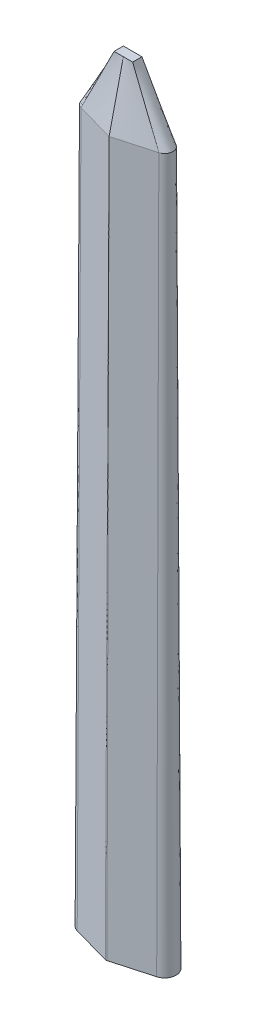
ISO-10303-21;
HEADER;
FILE_DESCRIPTION(('STEP AP214'),'2;1');
FILE_NAME('part.step','',(''),(''),'','','');
FILE_SCHEMA(('AUTOMOTIVE_DESIGN { 1 0 10303 214 1 1 1 1 }'));
ENDSEC;
DATA;
#1=APPLICATION_CONTEXT('core data for automotive mechanical design processes');
#2=APPLICATION_PROTOCOL_DEFINITION('international standard','automotive_design',2000,#1);
#3=PRODUCT_CONTEXT('',#1,'mechanical');
#4=PRODUCT('Part','Part','',(#3));
#5=PRODUCT_RELATED_PRODUCT_CATEGORY('part','',(#4));
#6=PRODUCT_DEFINITION_FORMATION('','',#4);
#7=PRODUCT_DEFINITION_CONTEXT('part definition',#1,'design');
#8=PRODUCT_DEFINITION('design','',#6,#7);
#9=PRODUCT_DEFINITION_SHAPE('','',#8);
#10=(LENGTH_UNIT() NAMED_UNIT(*) SI_UNIT(.MILLI.,.METRE.));
#11=(NAMED_UNIT(*) PLANE_ANGLE_UNIT() SI_UNIT($,.RADIAN.));
#12=(NAMED_UNIT(*) SI_UNIT($,.STERADIAN.) SOLID_ANGLE_UNIT());
#13=UNCERTAINTY_MEASURE_WITH_UNIT(LENGTH_MEASURE(1.E-05),#10,'distance_accuracy_value','');
#14=(GEOMETRIC_REPRESENTATION_CONTEXT(3) GLOBAL_UNCERTAINTY_ASSIGNED_CONTEXT((#13)) GLOBAL_UNIT_ASSIGNED_CONTEXT((#10,
#11,#12)) REPRESENTATION_CONTEXT('',''));
#15=CARTESIAN_POINT('',(0.,0.,0.));
#16=DIRECTION('',(0.,0.,1.));
#17=DIRECTION('',(1.,0.,0.));
#18=AXIS2_PLACEMENT_3D('',#15,#16,#17);
#19=CARTESIAN_POINT('',(0.,0.,-6.1));
#20=DIRECTION('',(0.,-1.,0.));
#21=DIRECTION('',(0.,0.,1.));
#22=AXIS2_PLACEMENT_3D('',#19,#20,#21);
#23=CONICAL_SURFACE('',#22,1.00914801576978,0.00436332312998583);
#24=CARTESIAN_POINT('',(0.,0.,-6.1));
#25=DIRECTION('',(0.,1.,0.));
#26=DIRECTION('',(0.,0.,1.));
#27=AXIS2_PLACEMENT_3D('',#24,#25,#26);
#28=CIRCLE('',#27,1.00914801576978);
#29=CARTESIAN_POINT('',(0.270530283915286,0.,-7.07221041097944));
#30=VERTEX_POINT('',#29);
#31=CARTESIAN_POINT('',(-0.270530283915274,0.,-7.07221041097944));
#32=VERTEX_POINT('',#31);
#33=EDGE_CURVE('E531',#30,#32,#28,.T.);
#34=ORIENTED_EDGE('',*,*,#33,.T.);
#35=DIRECTION('',(-0.00116970680332982,-0.999990480720734,-0.00420360011283182));
#36=VECTOR('',#35,1.);
#37=CARTESIAN_POINT('',(-0.270530283915274,0.,-7.07221041097944));
#38=LINE('',#37,#36);
#39=CARTESIAN_POINT('',(0.,230.,-6.10537318143453));
#40=VERTEX_POINT('',#39);
#41=EDGE_CURVE('E477',#40,#32,#38,.T.);
#42=ORIENTED_EDGE('',*,*,#41,.F.);
#43=DIRECTION('',(0.00116970680332981,-0.999990480720734,-0.00420360011283182));
#44=VECTOR('',#43,1.);
#45=CARTESIAN_POINT('',(0.270530283915286,0.,-7.07221041097944));
#46=LINE('',#45,#44);
#47=EDGE_CURVE('E485',#40,#30,#46,.T.);
#48=ORIENTED_EDGE('',*,*,#47,.T.);
#49=EDGE_LOOP('',(#34,#42,#48));
#50=FACE_BOUND('',#49,.T.);
#51=ADVANCED_FACE('F69',(#50),#23,.T.);
#52=CARTESIAN_POINT('',(-0.270530283915274,0.,-7.07221041097944));
#53=DIRECTION('',(-0.268075351122406,0.00436330928474658,-0.963388067007623));
#54=DIRECTION('',(-0.963397237854974,0.,0.26807790303083));
#55=AXIS2_PLACEMENT_3D('',#52,#53,#54);
#56=PLANE('',#55);
#57=DIRECTION('',(-0.963397237854974,0.,0.26807790303083));
#58=VECTOR('',#57,1.);
#59=CARTESIAN_POINT('',(-0.270530283915274,0.,-7.07221041097944));
#60=LINE('',#59,#58);
#61=CARTESIAN_POINT('',(-12.8443406220985,0.,-3.57338295318787));
#62=VERTEX_POINT('',#61);
#63=EDGE_CURVE('E528',#32,#62,#60,.T.);
#64=ORIENTED_EDGE('',*,*,#63,.T.);
#65=DIRECTION('',(-0.00116970680332981,-0.999990480720734,-0.00420360011283182));
#66=VECTOR('',#65,1.);
#67=CARTESIAN_POINT('',(-12.8443406220985,0.,-3.57338295318787));
#68=LINE('',#67,#66);
#69=CARTESIAN_POINT('',(-12.5753054963122,230.,-2.60654572364296));
#70=VERTEX_POINT('',#69);
#71=EDGE_CURVE('E482',#70,#62,#68,.T.);
#72=ORIENTED_EDGE('',*,*,#71,.F.);
#73=DIRECTION('',(-0.963397237854974,0.,0.26807790303083));
#74=VECTOR('',#73,1.);
#75=CARTESIAN_POINT('',(-0.00149515812892143,230.,-6.10537318143453));
#76=LINE('',#75,#74);
#77=EDGE_CURVE('E446',#40,#70,#76,.T.);
#78=ORIENTED_EDGE('',*,*,#77,.F.);
#79=ORIENTED_EDGE('',*,*,#41,.T.);
#80=EDGE_LOOP('',(#64,#72,#78,#79));
#81=FACE_BOUND('',#80,.T.);
#82=ADVANCED_FACE('F718',(#81),#56,.T.);
#83=CARTESIAN_POINT('',(-11.85,0.,0.));
#84=DIRECTION('',(0.,-1.,0.));
#85=DIRECTION('',(0.,0.,1.));
#86=AXIS2_PLACEMENT_3D('',#83,#84,#85);
#87=CONICAL_SURFACE('',#86,3.70914801576978,0.00436332312998583);
#88=CARTESIAN_POINT('',(-11.85,0.,0.));
#89=DIRECTION('',(0.,1.,0.));
#90=DIRECTION('',(0.,0.,1.));
#91=AXIS2_PLACEMENT_3D('',#88,#89,#90);
#92=CIRCLE('',#91,3.70914801576978);
#93=CARTESIAN_POINT('',(-12.8443406220985,0.,3.57338295318787));
#94=VERTEX_POINT('',#93);
#95=EDGE_CURVE('E525',#62,#94,#92,.T.);
#96=ORIENTED_EDGE('',*,*,#95,.T.);
#97=DIRECTION('',(-0.00116970680332981,-0.999990480720734,0.00420360011283182));
#98=VECTOR('',#97,1.);
#99=CARTESIAN_POINT('',(-12.8443406220985,0.,3.57338295318787));
#100=LINE('',#99,#98);
#101=CARTESIAN_POINT('',(-12.5753054963122,230.,2.60654572364296));
#102=VERTEX_POINT('',#101);
#103=EDGE_CURVE('E474',#102,#94,#100,.T.);
#104=ORIENTED_EDGE('',*,*,#103,.F.);
#105=CARTESIAN_POINT('',(-12.5753054963122,230.,-2.60654572364296));
#106=CARTESIAN_POINT('',(-12.6114563932215,230.000007225369,-2.5964861900037));
#107=CARTESIAN_POINT('',(-12.6473934194865,230.000089608595,-2.58567547119507));
#108=CARTESIAN_POINT('',(-12.7187864080056,230.000329309486,-2.56256885966117));
#109=CARTESIAN_POINT('',(-12.7542423721637,230.000486626855,-2.55027297281584));
#110=CARTESIAN_POINT('',(-12.8597902913709,230.000957826549,-2.51119019631628));
#111=CARTESIAN_POINT('',(-12.9290816682881,230.001271040976,-2.48220279095765));
#112=CARTESIAN_POINT('',(-13.0649687079224,230.001670643937,-2.41859190481421));
#113=CARTESIAN_POINT('',(-13.1315659003823,230.001757163019,-2.38397168002757));
#114=CARTESIAN_POINT('',(-13.2616571338923,230.001653723151,-2.30931962888276));
#115=CARTESIAN_POINT('',(-13.3251511787795,230.001463764542,-2.26928780921609));
#116=CARTESIAN_POINT('',(-13.4494657804984,230.000846340845,-2.18348854748175));
#117=CARTESIAN_POINT('',(-13.5102359632002,230.000415561838,-2.13764813543431));
#118=CARTESIAN_POINT('',(-13.627700393699,229.999623863179,-2.04101031362432));
#119=CARTESIAN_POINT('',(-13.6843945671038,229.999262944801,-1.99021281342882));
#120=CARTESIAN_POINT('',(-13.7932924564327,229.998758883674,-1.8840314811998));
#121=CARTESIAN_POINT('',(-13.8454970070409,229.99861570036,-1.82864850544497));
#122=CARTESIAN_POINT('',(-13.9450551739325,229.998633791299,-1.7136822848377));
#123=CARTESIAN_POINT('',(-13.9924088139629,229.998795064062,-1.65409906054953));
#124=CARTESIAN_POINT('',(-14.0819196760416,229.999333219242,-1.53116911290684));
#125=CARTESIAN_POINT('',(-14.1240779478046,229.999710058017,-1.46782315365198));
#126=CARTESIAN_POINT('',(-14.2029117663397,230.000363949684,-1.33780643346991));
#127=CARTESIAN_POINT('',(-14.2395873174444,230.000641002653,-1.27113567517003));
#128=CARTESIAN_POINT('',(-14.3072009027807,230.000979436492,-1.13493209580544));
#129=CARTESIAN_POINT('',(-14.3381380478227,230.001040783963,-1.06539883322027));
#130=CARTESIAN_POINT('',(-14.3940479785404,230.000896920646,-0.923974682350856));
#131=CARTESIAN_POINT('',(-14.4190207435258,230.000691708933,-0.852083785889032));
#132=CARTESIAN_POINT('',(-14.4628295065202,230.000245423498,-0.706434235571706));
#133=CARTESIAN_POINT('',(-14.4816638557704,230.000004340167,-0.632675085633168));
#134=CARTESIAN_POINT('',(-14.5130517811376,229.999720893798,-0.483834649586878));
#135=CARTESIAN_POINT('',(-14.5256053714758,229.999678530311,-0.408753366473125));
#136=CARTESIAN_POINT('',(-14.5443418693743,229.999749122724,-0.257796217289434));
#137=CARTESIAN_POINT('',(-14.5505252677514,229.999862066657,-0.18192041289167));
#138=CARTESIAN_POINT('',(-14.554991901975,229.999974808288,-0.0679375519443198));
#139=CARTESIAN_POINT('',(-14.5556791771169,230.000002943096,-0.0299108050769732));
#140=CARTESIAN_POINT('',(-14.5554511499297,229.999996114029,0.0461378790196297));
#141=CARTESIAN_POINT('',(-14.5545358474551,229.999961150148,0.0841598162484493));
#142=CARTESIAN_POINT('',(-14.5493854824651,229.999838238708,0.198118926249784));
#143=CARTESIAN_POINT('',(-14.5427464302863,229.999732266032,0.273961371555549));
#144=CARTESIAN_POINT('',(-14.5231034014869,229.99968296884,0.424807464363447));
#145=CARTESIAN_POINT('',(-14.5100994375171,229.999739644001,0.499811113532432));
#146=CARTESIAN_POINT('',(-14.4778182346591,230.000047354978,0.648462129272696));
#147=CARTESIAN_POINT('',(-14.458540684601,230.000298400436,0.72210942837752));
#148=CARTESIAN_POINT('',(-14.4138505239472,230.0007378932,0.867517867584566));
#149=CARTESIAN_POINT('',(-14.3884379203833,230.000926340578,0.939279009848581));
#150=CARTESIAN_POINT('',(-14.331659286816,230.001035799597,1.08040563503285));
#151=CARTESIAN_POINT('',(-14.3002933257409,230.000956814335,1.14977114567888));
#152=CARTESIAN_POINT('',(-14.2318306180704,230.000587889274,1.28561382144818));
#153=CARTESIAN_POINT('',(-14.1947338276773,230.000297947863,1.3520909644922));
#154=CARTESIAN_POINT('',(-14.1150730842732,229.999634085879,1.48168357376822));
#155=CARTESIAN_POINT('',(-14.0725091695106,229.999260165892,1.54479906351421));
#156=CARTESIAN_POINT('',(-13.9822155396203,229.998749805429,1.6672192069278));
#157=CARTESIAN_POINT('',(-13.9344859255474,229.998613360309,1.72652393510782));
#158=CARTESIAN_POINT('',(-13.834193936591,229.998638567584,1.84090772330834));
#159=CARTESIAN_POINT('',(-13.7816310134596,229.998800253838,1.89598630264878));
#160=CARTESIAN_POINT('',(-13.6720522796682,229.999335348502,2.00151859977009));
#161=CARTESIAN_POINT('',(-13.6150364119813,229.999708759624,2.05197225830377));
#162=CARTESIAN_POINT('',(-13.4969690037837,230.000505210167,2.14788531426279));
#163=CARTESIAN_POINT('',(-13.4359185244465,230.00092823656,2.19334601661552));
#164=CARTESIAN_POINT('',(-13.310231188882,230.001520993615,2.27895215720668));
#165=CARTESIAN_POINT('',(-13.2455950653873,230.001690775832,2.31909867577138));
#166=CARTESIAN_POINT('',(-13.0841747969021,230.001751575344,2.41015459767389));
#167=CARTESIAN_POINT('',(-12.9856867304961,230.00148832698,2.45809937408764));
#168=CARTESIAN_POINT('',(-12.8342902483684,230.000851882387,2.52077153860593));
#169=CARTESIAN_POINT('',(-12.7832369579247,230.000599633869,2.540115039083));
#170=CARTESIAN_POINT('',(-12.6800442636341,230.000187386022,2.57568371165004));
#171=CARTESIAN_POINT('',(-12.6279046558845,230.000027404175,2.59190829236378));
#172=CARTESIAN_POINT('',(-12.5753054963122,230.,2.60654572364296));
#173=B_SPLINE_CURVE_WITH_KNOTS('',3,(#105,#106,#107,#108,#109,#110,#111,#112,#113,#114,#115,
#116,#117,#118,#119,#120,#121,#122,#123,#124,#125,#126,#127,#128,#129,#130,#131,#132,#133,#134,
#135,#136,#137,#138,#139,#140,#141,#142,#143,#144,#145,#146,#147,#148,#149,#150,#151,#152,#153,
#154,#155,#156,#157,#158,#159,#160,#161,#162,#163,#164,#165,#166,#167,#168,#169,#170,#171,#172),
.UNSPECIFIED.,.F.,.F.,(4,2,2,2,2,2,2,2,2,2,2,2,2,2,2,2,2,2,2,2,2,2,2,2,2,2,2,2,2,2,2,2,2,4),(0.,
0.112555889927781,0.225111334248274,0.450162013003811,0.675083062513077,0.900003833907121,
1.12809874363309,1.35619781530874,1.58425438806581,1.81230984434365,2.04031914661809,
2.2683282687167,2.4963726923063,2.72441790696365,2.9525243234547,3.18063022346035,
3.40871854682498,3.52278825712151,3.63685797776697,3.86496158447767,4.09306473782093,
4.32117920680619,4.5492934143297,4.77740498089494,5.00551829088317,5.23363000506135,
5.46173725757688,5.6898704165571,5.91800649761142,6.14608281186475,6.37411268879075,
6.70180349868786,6.86550697512056,7.02924146070607),.UNSPECIFIED.);
#174=EDGE_CURVE('E437',#70,#102,#173,.T.);
#175=ORIENTED_EDGE('',*,*,#174,.F.);
#176=ORIENTED_EDGE('',*,*,#71,.T.);
#177=EDGE_LOOP('',(#96,#104,#175,#176));
#178=FACE_BOUND('',#177,.T.);
#179=ADVANCED_FACE('F724',(#178),#87,.T.);
#180=CARTESIAN_POINT('',(-12.8443406220985,0.,3.57338295318787));
#181=DIRECTION('',(-0.268075351122406,0.00436330928474658,0.963388067007623));
#182=DIRECTION('',(0.963397237854974,0.,0.26807790303083));
#183=AXIS2_PLACEMENT_3D('',#180,#181,#182);
#184=PLANE('',#183);
#185=DIRECTION('',(0.963397237854974,0.,0.26807790303083));
#186=VECTOR('',#185,1.);
#187=CARTESIAN_POINT('',(-12.8443406220985,0.,3.57338295318787));
#188=LINE('',#187,#186);
#189=CARTESIAN_POINT('',(-0.270530283915282,0.,7.07221041097944));
#190=VERTEX_POINT('',#189);
#191=EDGE_CURVE('E522',#94,#190,#188,.T.);
#192=ORIENTED_EDGE('',*,*,#191,.T.);
#193=DIRECTION('',(-0.0011697068033298,-0.999990480720734,0.00420360011283182));
#194=VECTOR('',#193,1.);
#195=CARTESIAN_POINT('',(-0.270530283915282,0.,7.07221041097944));
#196=LINE('',#195,#194);
#197=CARTESIAN_POINT('',(0.,230.,6.10537318143453));
#198=VERTEX_POINT('',#197);
#199=EDGE_CURVE('E467',#198,#190,#196,.T.);
#200=ORIENTED_EDGE('',*,*,#199,.F.);
#201=DIRECTION('',(0.963397237854974,0.,0.26807790303083));
#202=VECTOR('',#201,1.);
#203=CARTESIAN_POINT('',(-12.5753054963122,230.,2.60654572364296));
#204=LINE('',#203,#202);
#205=EDGE_CURVE('E601',#102,#198,#204,.T.);
#206=ORIENTED_EDGE('',*,*,#205,.F.);
#207=ORIENTED_EDGE('',*,*,#103,.T.);
#208=EDGE_LOOP('',(#192,#200,#206,#207));
#209=FACE_BOUND('',#208,.T.);
#210=ADVANCED_FACE('F760',(#209),#184,.T.);
#211=CARTESIAN_POINT('',(0.,0.,6.1));
#212=DIRECTION('',(0.,-1.,0.));
#213=DIRECTION('',(0.,0.,1.));
#214=AXIS2_PLACEMENT_3D('',#211,#212,#213);
#215=CONICAL_SURFACE('',#214,1.00914801576978,0.00436332312998583);
#216=CARTESIAN_POINT('',(0.,0.,6.1));
#217=DIRECTION('',(0.,1.,0.));
#218=DIRECTION('',(0.,0.,1.));
#219=AXIS2_PLACEMENT_3D('',#216,#217,#218);
#220=CIRCLE('',#219,1.00914801576978);
#221=CARTESIAN_POINT('',(0.270530283915291,0.,7.07221041097944));
#222=VERTEX_POINT('',#221);
#223=EDGE_CURVE('E519',#190,#222,#220,.T.);
#224=ORIENTED_EDGE('',*,*,#223,.T.);
#225=DIRECTION('',(0.00116970680332982,-0.999990480720734,0.00420360011283182));
#226=VECTOR('',#225,1.);
#227=CARTESIAN_POINT('',(0.270530283915291,0.,7.07221041097944));
#228=LINE('',#227,#226);
#229=EDGE_CURVE('E463',#198,#222,#228,.T.);
#230=ORIENTED_EDGE('',*,*,#229,.F.);
#231=ORIENTED_EDGE('',*,*,#199,.T.);
#232=EDGE_LOOP('',(#224,#230,#231));
#233=FACE_BOUND('',#232,.T.);
#234=ADVANCED_FACE('F763',(#233),#215,.T.);
#235=CARTESIAN_POINT('',(0.270530283915291,0.,7.07221041097944));
#236=DIRECTION('',(0.268075351122406,0.00436330928474658,0.963388067007623));
#237=DIRECTION('',(0.963397237854974,0.,-0.26807790303083));
#238=AXIS2_PLACEMENT_3D('',#235,#236,#237);
#239=PLANE('',#238);
#240=DIRECTION('',(0.963397237854974,0.,-0.26807790303083));
#241=VECTOR('',#240,1.);
#242=CARTESIAN_POINT('',(0.270530283915291,0.,7.07221041097944));
#243=LINE('',#242,#241);
#244=CARTESIAN_POINT('',(12.8443406220985,0.,3.57338295318787));
#245=VERTEX_POINT('',#244);
#246=EDGE_CURVE('E516',#222,#245,#243,.T.);
#247=ORIENTED_EDGE('',*,*,#246,.T.);
#248=DIRECTION('',(0.00116970680332982,-0.999990480720734,0.00420360011283182));
#249=VECTOR('',#248,1.);
#250=CARTESIAN_POINT('',(12.8443406220985,0.,3.57338295318787));
#251=LINE('',#250,#249);
#252=CARTESIAN_POINT('',(12.5753054963122,230.,2.60654572364296));
#253=VERTEX_POINT('',#252);
#254=EDGE_CURVE('E468',#253,#245,#251,.T.);
#255=ORIENTED_EDGE('',*,*,#254,.F.);
#256=DIRECTION('',(0.963397237854974,0.,-0.26807790303083));
#257=VECTOR('',#256,1.);
#258=CARTESIAN_POINT('',(0.00149515812893861,230.,6.10537318143453));
#259=LINE('',#258,#257);
#260=EDGE_CURVE('E232',#198,#253,#259,.T.);
#261=ORIENTED_EDGE('',*,*,#260,.F.);
#262=ORIENTED_EDGE('',*,*,#229,.T.);
#263=EDGE_LOOP('',(#247,#255,#261,#262));
#264=FACE_BOUND('',#263,.T.);
#265=ADVANCED_FACE('F737',(#264),#239,.T.);
#266=CARTESIAN_POINT('',(11.85,0.,0.));
#267=DIRECTION('',(0.,-1.,0.));
#268=DIRECTION('',(0.,0.,1.));
#269=AXIS2_PLACEMENT_3D('',#266,#267,#268);
#270=CONICAL_SURFACE('',#269,3.70914801576978,0.00436332312998583);
#271=CARTESIAN_POINT('',(11.85,0.,0.));
#272=DIRECTION('',(0.,1.,0.));
#273=DIRECTION('',(0.,0.,1.));
#274=AXIS2_PLACEMENT_3D('',#271,#272,#273);
#275=CIRCLE('',#274,3.70914801576978);
#276=CARTESIAN_POINT('',(12.8443406220985,0.,-3.57338295318786));
#277=VERTEX_POINT('',#276);
#278=EDGE_CURVE('E513',#245,#277,#275,.T.);
#279=ORIENTED_EDGE('',*,*,#278,.T.);
#280=DIRECTION('',(0.00116970680332982,-0.999990480720734,-0.00420360011283182));
#281=VECTOR('',#280,1.);
#282=CARTESIAN_POINT('',(12.8443406220985,0.,-3.57338295318786));
#283=LINE('',#282,#281);
#284=CARTESIAN_POINT('',(12.5753054963122,230.,-2.60654572364295));
#285=VERTEX_POINT('',#284);
#286=EDGE_CURVE('E489',#285,#277,#283,.T.);
#287=ORIENTED_EDGE('',*,*,#286,.F.);
#288=CARTESIAN_POINT('',(12.5753054963122,230.,2.60654572364296));
#289=CARTESIAN_POINT('',(12.6114563932216,230.000007225369,2.5964861900037));
#290=CARTESIAN_POINT('',(12.6473934194865,230.000089608595,2.58567547119507));
#291=CARTESIAN_POINT('',(12.7187864080056,230.000329309486,2.56256885966116));
#292=CARTESIAN_POINT('',(12.7542423721637,230.000486626855,2.55027297281583));
#293=CARTESIAN_POINT('',(12.859790291371,230.000957826549,2.51119019631627));
#294=CARTESIAN_POINT('',(12.9290816682881,230.001271040976,2.48220279095763));
#295=CARTESIAN_POINT('',(13.0649687079224,230.001670643937,2.41859190481418));
#296=CARTESIAN_POINT('',(13.1315659003823,230.001757163019,2.38397168002753));
#297=CARTESIAN_POINT('',(13.2616571338924,230.001653723151,2.30931962888271));
#298=CARTESIAN_POINT('',(13.3251511787796,230.001463764542,2.26928780921603));
#299=CARTESIAN_POINT('',(13.4494657804985,230.000846340845,2.18348854748168));
#300=CARTESIAN_POINT('',(13.5102359632003,230.000415561838,2.13764813543424));
#301=CARTESIAN_POINT('',(13.627700393699,229.999623863179,2.04101031362424));
#302=CARTESIAN_POINT('',(13.6843945671039,229.999262944801,1.99021281342874));
#303=CARTESIAN_POINT('',(13.7932924564328,229.998758883674,1.88403148119971));
#304=CARTESIAN_POINT('',(13.845497007041,229.99861570036,1.82864850544488));
#305=CARTESIAN_POINT('',(13.9450551739325,229.9986337913,1.7136822848376));
#306=CARTESIAN_POINT('',(13.992408813963,229.998795064062,1.65409906054943));
#307=CARTESIAN_POINT('',(14.0819196760417,229.999333219242,1.53116911290673));
#308=CARTESIAN_POINT('',(14.1240779478047,229.999710058017,1.46782315365187));
#309=CARTESIAN_POINT('',(14.2029117663398,230.000363949684,1.33780643346979));
#310=CARTESIAN_POINT('',(14.2395873174445,230.000641002653,1.27113567516991));
#311=CARTESIAN_POINT('',(14.3072009027808,230.000979436492,1.13493209580531));
#312=CARTESIAN_POINT('',(14.3381380478228,230.001040783963,1.06539883322014));
#313=CARTESIAN_POINT('',(14.3940479785404,230.000896920646,0.923974682350721));
#314=CARTESIAN_POINT('',(14.4190207435259,230.000691708933,0.852083785888894));
#315=CARTESIAN_POINT('',(14.4628295065203,230.000245423498,0.706434235571564));
#316=CARTESIAN_POINT('',(14.4816638557704,230.000004340167,0.632675085633026));
#317=CARTESIAN_POINT('',(14.5130517811376,229.999720893798,0.483834649586736));
#318=CARTESIAN_POINT('',(14.5256053714758,229.99967853031,0.408753366472983));
#319=CARTESIAN_POINT('',(14.5443418693743,229.999749122724,0.257796217289293));
#320=CARTESIAN_POINT('',(14.5505252677514,229.999862066657,0.18192041289153));
#321=CARTESIAN_POINT('',(14.554991901975,229.999974808288,0.0679375519441806));
#322=CARTESIAN_POINT('',(14.5556791771169,230.000002943096,0.0299108050768343));
#323=CARTESIAN_POINT('',(14.5554511499297,229.999996114029,-0.0461378790197677));
#324=CARTESIAN_POINT('',(14.5545358474551,229.999961150148,-0.0841598162485869));
#325=CARTESIAN_POINT('',(14.5493854824651,229.999838238708,-0.198118926249921));
#326=CARTESIAN_POINT('',(14.5427464302863,229.999732266032,-0.273961371555686));
#327=CARTESIAN_POINT('',(14.5231034014869,229.99968296884,-0.424807464363582));
#328=CARTESIAN_POINT('',(14.5100994375171,229.999739644,-0.499811113532566));
#329=CARTESIAN_POINT('',(14.477818234659,230.000047354978,-0.648462129272827));
#330=CARTESIAN_POINT('',(14.458540684601,230.000298400436,-0.72210942837765));
#331=CARTESIAN_POINT('',(14.4138505239471,230.0007378932,-0.867517867584693));
#332=CARTESIAN_POINT('',(14.3884379203832,230.000926340578,-0.939279009848706));
#333=CARTESIAN_POINT('',(14.3316592868159,230.001035799597,-1.08040563503297));
#334=CARTESIAN_POINT('',(14.3002933257409,230.000956814335,-1.149771145679));
#335=CARTESIAN_POINT('',(14.2318306180704,230.000587889274,-1.28561382144829));
#336=CARTESIAN_POINT('',(14.1947338276772,230.000297947863,-1.35209096449232));
#337=CARTESIAN_POINT('',(14.1150730842731,229.999634085878,-1.48168357376833));
#338=CARTESIAN_POINT('',(14.0725091695105,229.999260165892,-1.54479906351432));
#339=CARTESIAN_POINT('',(13.9822155396203,229.998749805429,-1.6672192069279));
#340=CARTESIAN_POINT('',(13.9344859255473,229.998613360308,-1.72652393510792));
#341=CARTESIAN_POINT('',(13.8341939365909,229.998638567584,-1.84090772330844));
#342=CARTESIAN_POINT('',(13.7816310134595,229.998800253838,-1.89598630264887));
#343=CARTESIAN_POINT('',(13.6720522796681,229.999335348502,-2.00151859977018));
#344=CARTESIAN_POINT('',(13.6150364119812,229.999708759624,-2.05197225830386));
#345=CARTESIAN_POINT('',(13.4969690037836,230.000505210167,-2.14788531426286));
#346=CARTESIAN_POINT('',(13.4359185244464,230.00092823656,-2.1933460166156));
#347=CARTESIAN_POINT('',(13.3102311888819,230.001520993615,-2.27895215720675));
#348=CARTESIAN_POINT('',(13.2455950653872,230.001690775832,-2.31909867577145));
#349=CARTESIAN_POINT('',(13.084174796902,230.001751575344,-2.41015459767394));
#350=CARTESIAN_POINT('',(12.9856867304961,230.00148832698,-2.45809937408768));
#351=CARTESIAN_POINT('',(12.8342902483684,230.000851882387,-2.52077153860594));
#352=CARTESIAN_POINT('',(12.7832369579247,230.000599633869,-2.54011503908301));
#353=CARTESIAN_POINT('',(12.6800442636341,230.000187386022,-2.57568371165004));
#354=CARTESIAN_POINT('',(12.6279046558845,230.000027404175,-2.59190829236378));
#355=CARTESIAN_POINT('',(12.5753054963122,230.,-2.60654572364296));
#356=B_SPLINE_CURVE_WITH_KNOTS('',3,(#288,#289,#290,#291,#292,#293,#294,#295,#296,#297,#298,
#299,#300,#301,#302,#303,#304,#305,#306,#307,#308,#309,#310,#311,#312,#313,#314,#315,#316,#317,
#318,#319,#320,#321,#322,#323,#324,#325,#326,#327,#328,#329,#330,#331,#332,#333,#334,#335,#336,
#337,#338,#339,#340,#341,#342,#343,#344,#345,#346,#347,#348,#349,#350,#351,#352,#353,#354,#355),
.UNSPECIFIED.,.F.,.F.,(4,2,2,2,2,2,2,2,2,2,2,2,2,2,2,2,2,2,2,2,2,2,2,2,2,2,2,2,2,2,2,2,2,4),(0.,
0.112555889927796,0.225111334248304,0.45016201300387,0.675083062513165,0.900003833907234,
1.12809874363321,1.35619781530886,1.58425438806594,1.81230984434377,2.04031914661822,
2.26832826871684,2.49637269230643,2.72441790696379,2.95252432345484,3.18063022346048,
3.40871854682512,3.52278825712165,3.6368579777671,3.8649615844778,4.09306473782106,
4.32117920680632,4.54929341432984,4.77740498089507,5.00551829088331,5.23363000506148,
5.46173725757701,5.68987041655723,5.91800649761155,6.14608281186487,6.37411268879087,
6.70180349868791,6.86550697512057,7.02924146070605),.UNSPECIFIED.);
#357=EDGE_CURVE('E606',#253,#285,#356,.T.);
#358=ORIENTED_EDGE('',*,*,#357,.F.);
#359=ORIENTED_EDGE('',*,*,#254,.T.);
#360=EDGE_LOOP('',(#279,#287,#358,#359));
#361=FACE_BOUND('',#360,.T.);
#362=ADVANCED_FACE('F732',(#361),#270,.T.);
#363=CARTESIAN_POINT('',(12.8443406220985,0.,-3.57338295318786));
#364=DIRECTION('',(0.268075351122406,0.00436330928474658,-0.963388067007623));
#365=DIRECTION('',(-0.963397237854974,0.,-0.26807790303083));
#366=AXIS2_PLACEMENT_3D('',#363,#364,#365);
#367=PLANE('',#366);
#368=DIRECTION('',(-0.963397237854974,0.,-0.26807790303083));
#369=VECTOR('',#368,1.);
#370=CARTESIAN_POINT('',(12.8443406220985,0.,-3.57338295318786));
#371=LINE('',#370,#369);
#372=EDGE_CURVE('E510',#277,#30,#371,.T.);
#373=ORIENTED_EDGE('',*,*,#372,.T.);
#374=ORIENTED_EDGE('',*,*,#47,.F.);
#375=DIRECTION('',(-0.963397237854974,0.,-0.26807790303083));
#376=VECTOR('',#375,1.);
#377=CARTESIAN_POINT('',(12.5753054963122,230.,-2.60654572364295));
#378=LINE('',#377,#376);
#379=EDGE_CURVE('E314',#285,#40,#378,.T.);
#380=ORIENTED_EDGE('',*,*,#379,.F.);
#381=ORIENTED_EDGE('',*,*,#286,.T.);
#382=EDGE_LOOP('',(#373,#374,#380,#381));
#383=FACE_BOUND('',#382,.T.);
#384=ADVANCED_FACE('F729',(#383),#367,.T.);
#385=CARTESIAN_POINT('',(0.,0.,-6.1));
#386=DIRECTION('',(0.,1.,0.));
#387=DIRECTION('',(0.,0.,1.));
#388=AXIS2_PLACEMENT_3D('',#385,#386,#387);
#389=PLANE('',#388);
#390=DIRECTION('',(0.963397237854974,0.,0.26807790303083));
#391=VECTOR('',#390,1.);
#392=CARTESIAN_POINT('',(12.4422199396532,0.,-2.12827334000343));
#393=LINE('',#392,#391);
#394=CARTESIAN_POINT('',(12.4422199396532,0.,-2.12827334000343));
#395=VERTEX_POINT('',#394);
#396=CARTESIAN_POINT('',(0.,0.,-5.59048404542039));
#397=VERTEX_POINT('',#396);
#398=EDGE_CURVE('E552',#395,#397,#393,.F.);
#399=ORIENTED_EDGE('',*,*,#398,.T.);
#400=DIRECTION('',(0.963397237854974,0.,-0.26807790303083));
#401=VECTOR('',#400,1.);
#402=CARTESIAN_POINT('',(0.131590398530047,0.,-5.627100797795));
#403=LINE('',#402,#401);
#404=CARTESIAN_POINT('',(-12.4422199396532,0.,-2.12827334000343));
#405=VERTEX_POINT('',#404);
#406=EDGE_CURVE('E306',#397,#405,#403,.F.);
#407=ORIENTED_EDGE('',*,*,#406,.T.);
#408=CARTESIAN_POINT('',(-11.85,0.,0.));
#409=DIRECTION('',(0.,1.,0.));
#410=DIRECTION('',(0.,0.,1.));
#411=AXIS2_PLACEMENT_3D('',#408,#409,#410);
#412=CIRCLE('',#411,2.20913373671496);
#413=CARTESIAN_POINT('',(-12.4422199396532,0.,2.12827334000343));
#414=VERTEX_POINT('',#413);
#415=EDGE_CURVE('E536',#405,#414,#412,.T.);
#416=ORIENTED_EDGE('',*,*,#415,.T.);
#417=DIRECTION('',(-0.963397237854974,0.,-0.26807790303083));
#418=VECTOR('',#417,1.);
#419=CARTESIAN_POINT('',(-12.4422199396532,0.,2.12827334000343));
#420=LINE('',#419,#418);
#421=CARTESIAN_POINT('',(0.,0.,5.59048404542039));
#422=VERTEX_POINT('',#421);
#423=EDGE_CURVE('E540',#414,#422,#420,.F.);
#424=ORIENTED_EDGE('',*,*,#423,.T.);
#425=DIRECTION('',(-0.963397237854974,0.,0.26807790303083));
#426=VECTOR('',#425,1.);
#427=CARTESIAN_POINT('',(-0.131590398530029,0.,5.627100797795));
#428=LINE('',#427,#426);
#429=CARTESIAN_POINT('',(12.4422199396532,0.,2.12827334000343));
#430=VERTEX_POINT('',#429);
#431=EDGE_CURVE('E544',#422,#430,#428,.F.);
#432=ORIENTED_EDGE('',*,*,#431,.T.);
#433=CARTESIAN_POINT('',(11.85,0.,0.));
#434=DIRECTION('',(0.,1.,0.));
#435=DIRECTION('',(0.,0.,1.));
#436=AXIS2_PLACEMENT_3D('',#433,#434,#435);
#437=CIRCLE('',#436,2.20913373671496);
#438=EDGE_CURVE('E548',#430,#395,#437,.T.);
#439=ORIENTED_EDGE('',*,*,#438,.T.);
#440=EDGE_LOOP('',(#399,#407,#416,#424,#432,#439));
#441=FACE_BOUND('',#440,.T.);
#442=ORIENTED_EDGE('',*,*,#33,.F.);
#443=ORIENTED_EDGE('',*,*,#372,.F.);
#444=ORIENTED_EDGE('',*,*,#278,.F.);
#445=ORIENTED_EDGE('',*,*,#246,.F.);
#446=ORIENTED_EDGE('',*,*,#223,.F.);
#447=ORIENTED_EDGE('',*,*,#191,.F.);
#448=ORIENTED_EDGE('',*,*,#95,.F.);
#449=ORIENTED_EDGE('',*,*,#63,.F.);
#450=EDGE_LOOP('',(#442,#443,#444,#445,#446,#447,#448,#449));
#451=FACE_BOUND('',#450,.T.);
#452=ADVANCED_FACE('F691',(#441,#451),#389,.F.);
#453=CARTESIAN_POINT('',(0.131582742768336,-0.00654496392711987,-5.62712831046801));
#454=DIRECTION('',(-0.268075351122406,0.00436330928474658,-0.963388067007623));
#455=DIRECTION('',(-0.963397237854974,0.,0.26807790303083));
#456=AXIS2_PLACEMENT_3D('',#453,#454,#455);
#457=PLANE('',#456);
#458=DIRECTION('',(0.,-0.999989743650916,-0.00452908301706094));
#459=VECTOR('',#458,1.);
#460=CARTESIAN_POINT('',(0.,-0.00671079288924451,-5.59051443947022));
#461=LINE('',#460,#459);
#462=CARTESIAN_POINT('',(0.,228.794741032294,-4.55424304136869));
#463=VERTEX_POINT('',#462);
#464=EDGE_CURVE('E535',#463,#397,#461,.T.);
#465=ORIENTED_EDGE('',*,*,#464,.F.);
#466=DIRECTION('',(0.963397237854974,0.,-0.26807790303083));
#467=VECTOR('',#466,1.);
#468=CARTESIAN_POINT('',(0.399215711281695,228.794741032294,-4.66533004321192));
#469=LINE('',#468,#467);
#470=CARTESIAN_POINT('',(-12.1745946269016,228.794741032294,-1.16650258542035));
#471=VERTEX_POINT('',#470);
#472=EDGE_CURVE('E481',#463,#471,#469,.F.);
#473=ORIENTED_EDGE('',*,*,#472,.T.);
#474=DIRECTION('',(-0.00116970680332981,-0.999990480720734,-0.00420360011283182));
#475=VECTOR('',#474,1.);
#476=CARTESIAN_POINT('',(-12.4422275954149,-0.00654496392711987,-2.12830085267643));
#477=LINE('',#476,#475);
#478=EDGE_CURVE('E571',#471,#405,#477,.T.);
#479=ORIENTED_EDGE('',*,*,#478,.T.);
#480=ORIENTED_EDGE('',*,*,#406,.F.);
#481=EDGE_LOOP('',(#465,#473,#479,#480));
#482=FACE_BOUND('',#481,.T.);
#483=ADVANCED_FACE('F270',(#482),#457,.F.);
#484=CARTESIAN_POINT('',(-11.85,-0.00654496392711987,0.));
#485=DIRECTION('',(0.,-1.,0.));
#486=DIRECTION('',(0.,0.,1.));
#487=AXIS2_PLACEMENT_3D('',#484,#485,#486);
#488=CONICAL_SURFACE('',#487,2.20916229468868,0.00436332312998583);
#489=ORIENTED_EDGE('',*,*,#478,.F.);
#490=CARTESIAN_POINT('',(-11.85,228.794741032294,0.));
#491=DIRECTION('',(0.,1.,0.));
#492=DIRECTION('',(0.,0.,1.));
#493=AXIS2_PLACEMENT_3D('',#490,#491,#492);
#494=CIRCLE('',#493,1.21082201565949);
#495=CARTESIAN_POINT('',(-12.1745946269016,228.794741032294,1.16650258542035));
#496=VERTEX_POINT('',#495);
#497=EDGE_CURVE('E633',#471,#496,#494,.T.);
#498=ORIENTED_EDGE('',*,*,#497,.T.);
#499=DIRECTION('',(0.00116970680332981,0.999990480720734,-0.00420360011283182));
#500=VECTOR('',#499,1.);
#501=CARTESIAN_POINT('',(-12.4422275954149,-0.00654496392711987,2.12830085267643));
#502=LINE('',#501,#500);
#503=EDGE_CURVE('E568',#496,#414,#502,.F.);
#504=ORIENTED_EDGE('',*,*,#503,.T.);
#505=ORIENTED_EDGE('',*,*,#415,.F.);
#506=EDGE_LOOP('',(#489,#498,#504,#505));
#507=FACE_BOUND('',#506,.T.);
#508=ADVANCED_FACE('F976',(#507),#488,.F.);
#509=CARTESIAN_POINT('',(-12.4422275954149,-0.00654496392711987,2.12830085267643));
#510=DIRECTION('',(-0.268075351122406,0.00436330928474658,0.963388067007623));
#511=DIRECTION('',(0.963397237854974,0.,0.26807790303083));
#512=AXIS2_PLACEMENT_3D('',#509,#510,#511);
#513=PLANE('',#512);
#514=ORIENTED_EDGE('',*,*,#503,.F.);
#515=DIRECTION('',(-0.963397237854974,0.,-0.26807790303083));
#516=VECTOR('',#515,1.);
#517=CARTESIAN_POINT('',(-12.1745946269016,228.794741032294,1.16650258542035));
#518=LINE('',#517,#516);
#519=CARTESIAN_POINT('',(0.,228.794741032294,4.55424304136869));
#520=VERTEX_POINT('',#519);
#521=EDGE_CURVE('E636',#496,#520,#518,.F.);
#522=ORIENTED_EDGE('',*,*,#521,.T.);
#523=DIRECTION('',(0.,-0.999989743650916,0.00452908301706094));
#524=VECTOR('',#523,1.);
#525=CARTESIAN_POINT('',(0.,-0.0067107928892445,5.59051443947022));
#526=LINE('',#525,#524);
#527=EDGE_CURVE('E565',#520,#422,#526,.T.);
#528=ORIENTED_EDGE('',*,*,#527,.T.);
#529=ORIENTED_EDGE('',*,*,#423,.F.);
#530=EDGE_LOOP('',(#514,#522,#528,#529));
#531=FACE_BOUND('',#530,.T.);
#532=ADVANCED_FACE('F700',(#531),#513,.F.);
#533=CARTESIAN_POINT('',(-0.131582742768319,-0.00654496392711987,5.627128310468));
#534=DIRECTION('',(0.268075351122406,0.00436330928474658,0.963388067007623));
#535=DIRECTION('',(0.963397237854974,0.,-0.26807790303083));
#536=AXIS2_PLACEMENT_3D('',#533,#534,#535);
#537=PLANE('',#536);
#538=ORIENTED_EDGE('',*,*,#527,.F.);
#539=DIRECTION('',(-0.963397237854974,0.,0.26807790303083));
#540=VECTOR('',#539,1.);
#541=CARTESIAN_POINT('',(-0.399215711281678,228.794741032294,4.66533004321192));
#542=LINE('',#541,#540);
#543=CARTESIAN_POINT('',(12.1745946269016,228.794741032294,1.16650258542035));
#544=VERTEX_POINT('',#543);
#545=EDGE_CURVE('E95',#520,#544,#542,.F.);
#546=ORIENTED_EDGE('',*,*,#545,.T.);
#547=DIRECTION('',(0.00116970680332982,-0.999990480720734,0.00420360011283182));
#548=VECTOR('',#547,1.);
#549=CARTESIAN_POINT('',(12.4422275954149,-0.00654496392711987,2.12830085267643));
#550=LINE('',#549,#548);
#551=EDGE_CURVE('E562',#544,#430,#550,.T.);
#552=ORIENTED_EDGE('',*,*,#551,.T.);
#553=ORIENTED_EDGE('',*,*,#431,.F.);
#554=EDGE_LOOP('',(#538,#546,#552,#553));
#555=FACE_BOUND('',#554,.T.);
#556=ADVANCED_FACE('F696',(#555),#537,.F.);
#557=CARTESIAN_POINT('',(11.85,-0.00654496392711987,0.));
#558=DIRECTION('',(0.,-1.,0.));
#559=DIRECTION('',(0.,0.,1.));
#560=AXIS2_PLACEMENT_3D('',#557,#558,#559);
#561=CONICAL_SURFACE('',#560,2.20916229468868,0.00436332312998583);
#562=ORIENTED_EDGE('',*,*,#551,.F.);
#563=CARTESIAN_POINT('',(11.85,228.794741032294,0.));
#564=DIRECTION('',(0.,1.,0.));
#565=DIRECTION('',(0.,0.,1.));
#566=AXIS2_PLACEMENT_3D('',#563,#564,#565);
#567=CIRCLE('',#566,1.21082201565949);
#568=CARTESIAN_POINT('',(12.1745946269016,228.794741032294,-1.16650258542035));
#569=VERTEX_POINT('',#568);
#570=EDGE_CURVE('E80',#544,#569,#567,.T.);
#571=ORIENTED_EDGE('',*,*,#570,.T.);
#572=DIRECTION('',(-0.00116970680332982,0.999990480720734,0.00420360011283182));
#573=VECTOR('',#572,1.);
#574=CARTESIAN_POINT('',(12.4422275954149,-0.00654496392711987,-2.12830085267643));
#575=LINE('',#574,#573);
#576=EDGE_CURVE('E556',#569,#395,#575,.F.);
#577=ORIENTED_EDGE('',*,*,#576,.T.);
#578=ORIENTED_EDGE('',*,*,#438,.F.);
#579=EDGE_LOOP('',(#562,#571,#577,#578));
#580=FACE_BOUND('',#579,.T.);
#581=ADVANCED_FACE('F695',(#580),#561,.F.);
#582=CARTESIAN_POINT('',(12.4422275954149,-0.00654496392711987,-2.12830085267643));
#583=DIRECTION('',(0.268075351122406,0.00436330928474658,-0.963388067007623));
#584=DIRECTION('',(-0.963397237854974,0.,-0.26807790303083));
#585=AXIS2_PLACEMENT_3D('',#582,#583,#584);
#586=PLANE('',#585);
#587=ORIENTED_EDGE('',*,*,#576,.F.);
#588=DIRECTION('',(0.963397237854974,0.,0.26807790303083));
#589=VECTOR('',#588,1.);
#590=CARTESIAN_POINT('',(12.1745946269016,228.794741032294,-1.16650258542035));
#591=LINE('',#590,#589);
#592=EDGE_CURVE('E12',#569,#463,#591,.F.);
#593=ORIENTED_EDGE('',*,*,#592,.T.);
#594=ORIENTED_EDGE('',*,*,#464,.T.);
#595=ORIENTED_EDGE('',*,*,#398,.F.);
#596=EDGE_LOOP('',(#587,#593,#594,#595));
#597=FACE_BOUND('',#596,.T.);
#598=ADVANCED_FACE('F684',(#597),#586,.F.);
#599=CARTESIAN_POINT('',(0.,230.,-6.1));
#600=DIRECTION('',(0.,1.,0.));
#601=DIRECTION('',(0.,0.,1.));
#602=AXIS2_PLACEMENT_3D('',#599,#600,#601);
#603=PLANE('',#602);
#604=CARTESIAN_POINT('',(-11.85,230.,0.));
#605=DIRECTION('',(0.,1.,0.));
#606=DIRECTION('',(0.,0.,1.));
#607=AXIS2_PLACEMENT_3D('',#604,#605,#606);
#608=CIRCLE('',#607,0.00556304795363427);
#609=CARTESIAN_POINT('',(-11.8514913302299,230.,0.00535942503258685));
#610=VERTEX_POINT('',#609);
#611=CARTESIAN_POINT('',(-11.8514913302299,230.,-0.00535942503258636));
#612=VERTEX_POINT('',#611);
#613=EDGE_CURVE('E626',#610,#612,#608,.F.);
#614=ORIENTED_EDGE('',*,*,#613,.T.);
#615=DIRECTION('',(0.963397237854974,0.,-0.26807790303083));
#616=VECTOR('',#615,1.);
#617=CARTESIAN_POINT('',(0.722319007953372,230.,-3.50418688282416));
#618=LINE('',#617,#616);
#619=CARTESIAN_POINT('',(0.,230.,-3.30319215566198));
#620=VERTEX_POINT('',#619);
#621=EDGE_CURVE('E629',#612,#620,#618,.T.);
#622=ORIENTED_EDGE('',*,*,#621,.T.);
#623=DIRECTION('',(0.963397237854974,0.,0.26807790303083));
#624=VECTOR('',#623,1.);
#625=CARTESIAN_POINT('',(-0.722319007953372,230.,-3.50418688282416));
#626=LINE('',#625,#624);
#627=CARTESIAN_POINT('',(11.8514913302299,230.,-0.00535942503258603));
#628=VERTEX_POINT('',#627);
#629=EDGE_CURVE('E614',#620,#628,#626,.T.);
#630=ORIENTED_EDGE('',*,*,#629,.T.);
#631=CARTESIAN_POINT('',(11.85,230.,0.));
#632=DIRECTION('',(0.,1.,0.));
#633=DIRECTION('',(0.,0.,1.));
#634=AXIS2_PLACEMENT_3D('',#631,#632,#633);
#635=CIRCLE('',#634,0.00556304795363416);
#636=CARTESIAN_POINT('',(11.8514913302299,230.,0.00535942503258637));
#637=VERTEX_POINT('',#636);
#638=EDGE_CURVE('E617',#628,#637,#635,.F.);
#639=ORIENTED_EDGE('',*,*,#638,.T.);
#640=DIRECTION('',(-0.963397237854974,0.,0.26807790303083));
#641=VECTOR('',#640,1.);
#642=CARTESIAN_POINT('',(2.42852023002686,230.,2.62742458528459));
#643=LINE('',#642,#641);
#644=CARTESIAN_POINT('',(0.,230.,3.30319215566199));
#645=VERTEX_POINT('',#644);
#646=EDGE_CURVE('E620',#637,#645,#643,.T.);
#647=ORIENTED_EDGE('',*,*,#646,.T.);
#648=DIRECTION('',(-0.963397237854974,0.,-0.26807790303083));
#649=VECTOR('',#648,1.);
#650=CARTESIAN_POINT('',(-2.42852023002686,230.,2.62742458528459));
#651=LINE('',#650,#649);
#652=EDGE_CURVE('E623',#645,#610,#651,.T.);
#653=ORIENTED_EDGE('',*,*,#652,.T.);
#654=EDGE_LOOP('',(#614,#622,#630,#639,#647,#653));
#655=FACE_BOUND('',#654,.T.);
#656=ADVANCED_FACE('F265',(#655),#603,.F.);
#657=CARTESIAN_POINT('',(0.,250.,0.));
#658=DIRECTION('',(0.,1.,0.));
#659=DIRECTION('',(0.,0.,1.));
#660=AXIS2_PLACEMENT_3D('',#657,#658,#659);
#661=PLANE('',#660);
#662=DIRECTION('',(0.,0.,1.));
#663=VECTOR('',#662,1.);
#664=CARTESIAN_POINT('',(-3.,250.,-1.5));
#665=LINE('',#664,#663);
#666=CARTESIAN_POINT('',(-3.,250.,-1.5));
#667=VERTEX_POINT('',#666);
#668=CARTESIAN_POINT('',(-3.,250.,1.5));
#669=VERTEX_POINT('',#668);
#670=EDGE_CURVE('E234',#667,#669,#665,.T.);
#671=ORIENTED_EDGE('',*,*,#670,.T.);
#672=DIRECTION('',(1.,0.,0.));
#673=VECTOR('',#672,1.);
#674=CARTESIAN_POINT('',(-3.,250.,1.5));
#675=LINE('',#674,#673);
#676=CARTESIAN_POINT('',(0.,250.,1.5));
#677=VERTEX_POINT('',#676);
#678=EDGE_CURVE('E220',#669,#677,#675,.T.);
#679=ORIENTED_EDGE('',*,*,#678,.T.);
#680=CARTESIAN_POINT('',(3.,250.,1.5));
#681=VERTEX_POINT('',#680);
#682=EDGE_CURVE('E229',#677,#681,#675,.T.);
#683=ORIENTED_EDGE('',*,*,#682,.T.);
#684=DIRECTION('',(0.,0.,-1.));
#685=VECTOR('',#684,1.);
#686=CARTESIAN_POINT('',(3.,250.,-1.5));
#687=LINE('',#686,#685);
#688=CARTESIAN_POINT('',(3.,250.,-1.5));
#689=VERTEX_POINT('',#688);
#690=EDGE_CURVE('E203',#681,#689,#687,.T.);
#691=ORIENTED_EDGE('',*,*,#690,.T.);
#692=DIRECTION('',(-1.,0.,0.));
#693=VECTOR('',#692,1.);
#694=CARTESIAN_POINT('',(-3.,250.,-1.5));
#695=LINE('',#694,#693);
#696=CARTESIAN_POINT('',(0.,250.,-1.5));
#697=VERTEX_POINT('',#696);
#698=EDGE_CURVE('E300',#689,#697,#695,.T.);
#699=ORIENTED_EDGE('',*,*,#698,.T.);
#700=EDGE_CURVE('E219',#697,#667,#695,.T.);
#701=ORIENTED_EDGE('',*,*,#700,.T.);
#702=EDGE_LOOP('',(#671,#679,#683,#691,#699,#701));
#703=FACE_BOUND('',#702,.T.);
#704=ADVANCED_FACE('F241',(#703),#661,.T.);
#705=CARTESIAN_POINT('',(0.00149515812893856,230.,6.10537318143453));
#706=CARTESIAN_POINT('',(0.000343634788201909,250.,1.5));
#707=CARTESIAN_POINT('',(12.5753054963122,230.,2.60654572364296));
#708=CARTESIAN_POINT('',(3.,250.,1.5));
#709=B_SPLINE_SURFACE_WITH_KNOTS('',1,1,((#705,#706),(#707,#708)),.UNSPECIFIED.,.F.,.F.,.F.,(2,
2),(2,2),(0.,1.),(0.,1.),.UNSPECIFIED.);
#710=DIRECTION('',(-0.431289037660759,0.900836088888996,-0.0498408160931682));
#711=VECTOR('',#710,1.);
#712=CARTESIAN_POINT('',(7.78765274815609,240.,2.05327286182148));
#713=LINE('',#712,#711);
#714=EDGE_CURVE('E208',#253,#681,#713,.T.);
#715=DIRECTION('',(5.61078574920257E-05,0.97449796295651,-0.224396339198125));
#716=VECTOR('',#715,1.);
#717=CARTESIAN_POINT('',(-0.000919396458568065,240.,3.80268659071726));
#718=LINE('',#717,#716);
#719=EDGE_CURVE('E235',#198,#677,#718,.T.);
#720=ORIENTED_EDGE('',*,*,#260,.T.);
#721=ORIENTED_EDGE('',*,*,#714,.T.);
#722=ORIENTED_EDGE('',*,*,#682,.F.);
#723=ORIENTED_EDGE('',*,*,#719,.F.);
#724=EDGE_LOOP('',(#720,#721,#722,#723));
#725=FACE_BOUND('',#724,.T.);
#726=ADVANCED_FACE('F227',(#725),#709,.T.);
#727=CARTESIAN_POINT('',(12.5753054963122,230.,-2.60654572364295));
#728=CARTESIAN_POINT('',(3.,250.,-1.5));
#729=CARTESIAN_POINT('',(0.00149515812892902,230.,-6.10537318143453));
#730=CARTESIAN_POINT('',(0.000343634788200174,250.,-1.5));
#731=B_SPLINE_SURFACE_WITH_KNOTS('',1,1,((#727,#728),(#729,#730)),.UNSPECIFIED.,.F.,.F.,.F.,(2,
2),(2,2),(0.,1.),(0.,1.),.UNSPECIFIED.);
#732=DIRECTION('',(-5.61078574918567E-05,0.97449796295651,0.224396339198125));
#733=VECTOR('',#732,1.);
#734=CARTESIAN_POINT('',(0.000919396458564595,240.,-3.80268659071726));
#735=LINE('',#734,#733);
#736=EDGE_CURVE('E310',#40,#697,#735,.T.);
#737=DIRECTION('',(0.431289037660759,-0.900836088888996,-0.0498408160931682));
#738=VECTOR('',#737,1.);
#739=CARTESIAN_POINT('',(7.78765274815609,240.,-2.05327286182148));
#740=LINE('',#739,#738);
#741=EDGE_CURVE('E211',#689,#285,#740,.T.);
#742=ORIENTED_EDGE('',*,*,#379,.T.);
#743=ORIENTED_EDGE('',*,*,#736,.T.);
#744=ORIENTED_EDGE('',*,*,#698,.F.);
#745=ORIENTED_EDGE('',*,*,#741,.T.);
#746=EDGE_LOOP('',(#742,#743,#744,#745));
#747=FACE_BOUND('',#746,.T.);
#748=ADVANCED_FACE('F312',(#747),#731,.T.);
#749=CARTESIAN_POINT('',(12.6710585512753,229.8,2.61761118087939));
#750=CARTESIAN_POINT('',(12.5753054963122,230.,2.60654572364296));
#751=CARTESIAN_POINT('',(3.,250.,1.5));
#752=CARTESIAN_POINT('',(12.9665001965497,229.8,2.53665067246078));
#753=CARTESIAN_POINT('',(12.8678219767819,230.,2.52514918065424));
#754=CARTESIAN_POINT('',(3.,250.,1.375));
#755=CARTESIAN_POINT('',(13.5119511604495,229.8,2.28240725555925));
#756=CARTESIAN_POINT('',(13.4078724360886,230.,2.27094777778143));
#757=CARTESIAN_POINT('',(3.,250.,1.125));
#758=CARTESIAN_POINT('',(14.1511884993478,229.8,1.67134810382854));
#759=CARTESIAN_POINT('',(14.0407806924235,230.,1.66222584537479));
#760=CARTESIAN_POINT('',(3.,250.,0.75));
#761=CARTESIAN_POINT('',(14.5688446042903,229.8,0.901777490171364));
#762=CARTESIAN_POINT('',(14.4543015884062,230.,0.896561871456796));
#763=CARTESIAN_POINT('',(3.,250.,0.375));
#764=CARTESIAN_POINT('',(14.7222773482726,229.8,0.));
#765=CARTESIAN_POINT('',(14.6062151963095,230.,0.));
#766=CARTESIAN_POINT('',(3.,250.,0.));
#767=CARTESIAN_POINT('',(14.5688446042903,229.8,-0.901777490171357));
#768=CARTESIAN_POINT('',(14.4543015884062,230.,-0.896561871456789));
#769=CARTESIAN_POINT('',(3.,250.,-0.375));
#770=CARTESIAN_POINT('',(14.1511884993478,229.8,-1.67134810382853));
#771=CARTESIAN_POINT('',(14.0407806924235,230.,-1.66222584537479));
#772=CARTESIAN_POINT('',(3.,250.,-0.75));
#773=CARTESIAN_POINT('',(13.5119511604495,229.8,-2.28240725555924));
#774=CARTESIAN_POINT('',(13.4078724360886,230.,-2.27094777778143));
#775=CARTESIAN_POINT('',(3.,250.,-1.125));
#776=CARTESIAN_POINT('',(12.9665001965497,229.8,-2.53665067246078));
#777=CARTESIAN_POINT('',(12.8678219767819,230.,-2.52514918065424));
#778=CARTESIAN_POINT('',(3.,250.,-1.375));
#779=CARTESIAN_POINT('',(12.6710585512753,229.8,-2.61761118087938));
#780=CARTESIAN_POINT('',(12.5753054963122,230.,-2.60654572364295));
#781=CARTESIAN_POINT('',(3.,250.,-1.5));
#782=B_SPLINE_SURFACE_WITH_KNOTS('',3,1,((#749,#750,#751),(#752,#753,#754),(#755,#756,#757),
(#758,#759,#760),(#761,#762,#763),(#764,#765,#766),(#767,#768,#769),(#770,#771,#772),(#773,#774,
#775),(#776,#777,#778),(#779,#780,#781)),.UNSPECIFIED.,.F.,.F.,.F.,(4,1,1,1,1,1,1,1,4),(2,1,2),
(0.,0.125,0.25,0.375,0.5,0.625,0.75,0.875,1.),(-0.01,0.,1.),.UNSPECIFIED.);
#783=ORIENTED_EDGE('',*,*,#357,.T.);
#784=ORIENTED_EDGE('',*,*,#741,.F.);
#785=ORIENTED_EDGE('',*,*,#690,.F.);
#786=ORIENTED_EDGE('',*,*,#714,.F.);
#787=EDGE_LOOP('',(#783,#784,#785,#786));
#788=FACE_BOUND('',#787,.T.);
#789=ADVANCED_FACE('F207',(#788),#782,.T.);
#790=CARTESIAN_POINT('',(-0.00149515812892127,230.,-6.10537318143453));
#791=CARTESIAN_POINT('',(-0.000343634788199307,250.,-1.5));
#792=CARTESIAN_POINT('',(-12.5753054963122,230.,-2.60654572364296));
#793=CARTESIAN_POINT('',(-3.,250.,-1.5));
#794=B_SPLINE_SURFACE_WITH_KNOTS('',1,1,((#790,#791),(#792,#793)),.UNSPECIFIED.,.F.,.F.,.F.,(2,
2),(2,2),(0.,1.),(0.,1.),.UNSPECIFIED.);
#795=DIRECTION('',(0.431289037660759,0.900836088888996,0.0498408160931683));
#796=VECTOR('',#795,1.);
#797=CARTESIAN_POINT('',(-7.78765274815609,240.,-2.05327286182148));
#798=LINE('',#797,#796);
#799=EDGE_CURVE('E319',#70,#667,#798,.T.);
#800=ORIENTED_EDGE('',*,*,#77,.T.);
#801=ORIENTED_EDGE('',*,*,#799,.T.);
#802=ORIENTED_EDGE('',*,*,#700,.F.);
#803=ORIENTED_EDGE('',*,*,#736,.F.);
#804=EDGE_LOOP('',(#800,#801,#802,#803));
#805=FACE_BOUND('',#804,.T.);
#806=ADVANCED_FACE('F383',(#805),#794,.T.);
#807=CARTESIAN_POINT('',(-12.6710585512753,229.8,-2.61761118087939));
#808=CARTESIAN_POINT('',(-12.5753054963122,230.,-2.60654572364296));
#809=CARTESIAN_POINT('',(-3.,250.,-1.5));
#810=CARTESIAN_POINT('',(-12.9665001965497,229.8,-2.53665067246078));
#811=CARTESIAN_POINT('',(-12.8678219767819,230.,-2.52514918065424));
#812=CARTESIAN_POINT('',(-3.,250.,-1.375));
#813=CARTESIAN_POINT('',(-13.5119511604495,229.8,-2.28240725555925));
#814=CARTESIAN_POINT('',(-13.4078724360886,230.,-2.27094777778143));
#815=CARTESIAN_POINT('',(-3.,250.,-1.125));
#816=CARTESIAN_POINT('',(-14.1511884993478,229.8,-1.67134810382854));
#817=CARTESIAN_POINT('',(-14.0407806924235,230.,-1.66222584537479));
#818=CARTESIAN_POINT('',(-3.,250.,-0.75));
#819=CARTESIAN_POINT('',(-14.5688446042903,229.8,-0.901777490171361));
#820=CARTESIAN_POINT('',(-14.4543015884063,230.,-0.896561871456793));
#821=CARTESIAN_POINT('',(-3.,250.,-0.375));
#822=CARTESIAN_POINT('',(-14.7222773482726,229.8,0.));
#823=CARTESIAN_POINT('',(-14.6062151963095,230.,0.));
#824=CARTESIAN_POINT('',(-3.,250.,0.));
#825=CARTESIAN_POINT('',(-14.5688446042903,229.8,0.901777490171366));
#826=CARTESIAN_POINT('',(-14.4543015884063,230.,0.896561871456797));
#827=CARTESIAN_POINT('',(-3.,250.,0.375));
#828=CARTESIAN_POINT('',(-14.1511884993478,229.8,1.67134810382854));
#829=CARTESIAN_POINT('',(-14.0407806924235,230.,1.66222584537479));
#830=CARTESIAN_POINT('',(-3.,250.,0.75));
#831=CARTESIAN_POINT('',(-13.5119511604495,229.8,2.28240725555925));
#832=CARTESIAN_POINT('',(-13.4078724360886,230.,2.27094777778144));
#833=CARTESIAN_POINT('',(-3.,250.,1.125));
#834=CARTESIAN_POINT('',(-12.9665001965497,229.8,2.53665067246078));
#835=CARTESIAN_POINT('',(-12.8678219767819,230.,2.52514918065424));
#836=CARTESIAN_POINT('',(-3.,250.,1.375));
#837=CARTESIAN_POINT('',(-12.6710585512753,229.8,2.61761118087939));
#838=CARTESIAN_POINT('',(-12.5753054963122,230.,2.60654572364296));
#839=CARTESIAN_POINT('',(-3.,250.,1.5));
#840=B_SPLINE_SURFACE_WITH_KNOTS('',3,1,((#807,#808,#809),(#810,#811,#812),(#813,#814,#815),
(#816,#817,#818),(#819,#820,#821),(#822,#823,#824),(#825,#826,#827),(#828,#829,#830),(#831,#832,
#833),(#834,#835,#836),(#837,#838,#839)),.UNSPECIFIED.,.F.,.F.,.F.,(4,1,1,1,1,1,1,1,4),(2,1,2),
(0.,0.125,0.25,0.375,0.5,0.625,0.75,0.875,1.),(-0.01,0.,1.),.UNSPECIFIED.);
#841=DIRECTION('',(0.431289037660758,0.900836088888996,-0.0498408160931684));
#842=VECTOR('',#841,1.);
#843=CARTESIAN_POINT('',(-7.78765274815609,240.,2.05327286182148));
#844=LINE('',#843,#842);
#845=EDGE_CURVE('E418',#102,#669,#844,.T.);
#846=ORIENTED_EDGE('',*,*,#174,.T.);
#847=ORIENTED_EDGE('',*,*,#845,.T.);
#848=ORIENTED_EDGE('',*,*,#670,.F.);
#849=ORIENTED_EDGE('',*,*,#799,.F.);
#850=EDGE_LOOP('',(#846,#847,#848,#849));
#851=FACE_BOUND('',#850,.T.);
#852=ADVANCED_FACE('F372',(#851),#840,.T.);
#853=CARTESIAN_POINT('',(-12.5753054963122,230.,2.60654572364296));
#854=CARTESIAN_POINT('',(-3.,250.,1.5));
#855=CARTESIAN_POINT('',(-0.00149515812893422,230.,6.10537318143453));
#856=CARTESIAN_POINT('',(-0.000343634788201909,250.,1.5));
#857=B_SPLINE_SURFACE_WITH_KNOTS('',1,1,((#853,#854),(#855,#856)),.UNSPECIFIED.,.F.,.F.,.F.,(2,
2),(2,2),(0.,1.),(0.,1.),.UNSPECIFIED.);
#858=ORIENTED_EDGE('',*,*,#205,.T.);
#859=ORIENTED_EDGE('',*,*,#719,.T.);
#860=ORIENTED_EDGE('',*,*,#678,.F.);
#861=ORIENTED_EDGE('',*,*,#845,.F.);
#862=EDGE_LOOP('',(#858,#859,#860,#861));
#863=FACE_BOUND('',#862,.T.);
#864=ADVANCED_FACE('F382',(#863),#857,.T.);
#865=CARTESIAN_POINT('',(-0.399215711281678,228.794741032294,4.66533004321192));
#866=DIRECTION('',(-0.189559703119371,-0.707106781186543,-0.681224719863645));
#867=DIRECTION('',(-0.963397237854974,0.,0.26807790303083));
#868=AXIS2_PLACEMENT_3D('',#865,#866,#867);
#869=PLANE('',#868);
#870=DIRECTION('',(0.,0.693803942848011,-0.72016393195477));
#871=VECTOR('',#870,1.);
#872=CARTESIAN_POINT('',(0.,230.487434276191,2.79723858112611));
#873=LINE('',#872,#871);
#874=EDGE_CURVE('E657',#645,#520,#873,.F.);
#875=ORIENTED_EDGE('',*,*,#874,.F.);
#876=ORIENTED_EDGE('',*,*,#646,.F.);
#877=DIRECTION('',(-0.189559703119369,0.707106781186552,-0.681224719863637));
#878=VECTOR('',#877,1.);
#879=CARTESIAN_POINT('',(12.1745946269016,228.794741032294,1.16650258542035));
#880=LINE('',#879,#878);
#881=EDGE_CURVE('E74',#544,#637,#880,.T.);
#882=ORIENTED_EDGE('',*,*,#881,.F.);
#883=ORIENTED_EDGE('',*,*,#545,.F.);
#884=EDGE_LOOP('',(#875,#876,#882,#883));
#885=FACE_BOUND('',#884,.T.);
#886=ADVANCED_FACE('F72',(#885),#869,.T.);
#887=CARTESIAN_POINT('',(11.85,228.794741032294,0.));
#888=DIRECTION('',(0.,-1.,0.));
#889=DIRECTION('',(0.,0.,-1.));
#890=AXIS2_PLACEMENT_3D('',#887,#888,#889);
#891=CONICAL_SURFACE('',#890,1.2108220156595,0.785398163397443);
#892=ORIENTED_EDGE('',*,*,#881,.T.);
#893=ORIENTED_EDGE('',*,*,#638,.F.);
#894=DIRECTION('',(-0.189559703119374,0.707106781186552,0.681224719863636));
#895=VECTOR('',#894,1.);
#896=CARTESIAN_POINT('',(12.1745946269016,228.794741032294,-1.16650258542035));
#897=LINE('',#896,#895);
#898=EDGE_CURVE('E654',#569,#628,#897,.T.);
#899=ORIENTED_EDGE('',*,*,#898,.F.);
#900=ORIENTED_EDGE('',*,*,#570,.F.);
#901=EDGE_LOOP('',(#892,#893,#899,#900));
#902=FACE_BOUND('',#901,.T.);
#903=ADVANCED_FACE('F669',(#902),#891,.F.);
#904=CARTESIAN_POINT('',(-12.1745946269016,228.794741032294,1.16650258542035));
#905=DIRECTION('',(0.189559703119371,-0.707106781186543,-0.681224719863645));
#906=DIRECTION('',(-0.963397237854974,0.,-0.26807790303083));
#907=AXIS2_PLACEMENT_3D('',#904,#905,#906);
#908=PLANE('',#907);
#909=ORIENTED_EDGE('',*,*,#874,.T.);
#910=ORIENTED_EDGE('',*,*,#521,.F.);
#911=DIRECTION('',(-0.189559703119366,-0.707106781186552,0.681224719863638));
#912=VECTOR('',#911,1.);
#913=CARTESIAN_POINT('',(-11.8514913302299,230.,0.00535942503258685));
#914=LINE('',#913,#912);
#915=EDGE_CURVE('E650',#610,#496,#914,.T.);
#916=ORIENTED_EDGE('',*,*,#915,.F.);
#917=ORIENTED_EDGE('',*,*,#652,.F.);
#918=EDGE_LOOP('',(#909,#910,#916,#917));
#919=FACE_BOUND('',#918,.T.);
#920=ADVANCED_FACE('F701',(#919),#908,.T.);
#921=CARTESIAN_POINT('',(12.1745946269016,228.794741032294,-1.16650258542035));
#922=DIRECTION('',(-0.189559703119371,-0.707106781186543,0.681224719863645));
#923=DIRECTION('',(0.963397237854974,0.,0.26807790303083));
#924=AXIS2_PLACEMENT_3D('',#921,#922,#923);
#925=PLANE('',#924);
#926=ORIENTED_EDGE('',*,*,#898,.T.);
#927=ORIENTED_EDGE('',*,*,#629,.F.);
#928=DIRECTION('',(0.,-0.69380394284801,-0.72016393195477));
#929=VECTOR('',#928,1.);
#930=CARTESIAN_POINT('',(0.,228.73923612572,-4.61185676953102));
#931=LINE('',#930,#929);
#932=EDGE_CURVE('E647',#463,#620,#931,.F.);
#933=ORIENTED_EDGE('',*,*,#932,.F.);
#934=ORIENTED_EDGE('',*,*,#592,.F.);
#935=EDGE_LOOP('',(#926,#927,#933,#934));
#936=FACE_BOUND('',#935,.T.);
#937=ADVANCED_FACE('F679',(#936),#925,.T.);
#938=CARTESIAN_POINT('',(-11.85,228.794741032294,0.));
#939=DIRECTION('',(0.,-1.,0.));
#940=DIRECTION('',(0.,0.,-1.));
#941=AXIS2_PLACEMENT_3D('',#938,#939,#940);
#942=CONICAL_SURFACE('',#941,1.2108220156595,0.785398163397443);
#943=ORIENTED_EDGE('',*,*,#915,.T.);
#944=ORIENTED_EDGE('',*,*,#497,.F.);
#945=DIRECTION('',(-0.189559703119369,-0.707106781186552,-0.681224719863637));
#946=VECTOR('',#945,1.);
#947=CARTESIAN_POINT('',(-11.8514913302299,230.,-0.00535942503258636));
#948=LINE('',#947,#946);
#949=EDGE_CURVE('E644',#612,#471,#948,.T.);
#950=ORIENTED_EDGE('',*,*,#949,.F.);
#951=ORIENTED_EDGE('',*,*,#613,.F.);
#952=EDGE_LOOP('',(#943,#944,#950,#951));
#953=FACE_BOUND('',#952,.T.);
#954=ADVANCED_FACE('F705',(#953),#942,.F.);
#955=CARTESIAN_POINT('',(0.399215711281695,228.794741032294,-4.66533004321192));
#956=DIRECTION('',(0.189559703119371,-0.707106781186544,0.681224719863645));
#957=DIRECTION('',(0.963397237854974,0.,-0.26807790303083));
#958=AXIS2_PLACEMENT_3D('',#955,#956,#957);
#959=PLANE('',#958);
#960=ORIENTED_EDGE('',*,*,#932,.T.);
#961=ORIENTED_EDGE('',*,*,#621,.F.);
#962=ORIENTED_EDGE('',*,*,#949,.T.);
#963=ORIENTED_EDGE('',*,*,#472,.F.);
#964=EDGE_LOOP('',(#960,#961,#962,#963));
#965=FACE_BOUND('',#964,.T.);
#966=ADVANCED_FACE('F708',(#965),#959,.T.);
#967=CLOSED_SHELL('',(#51,#82,#179,#210,#234,#265,#362,#384,#452,#483,#508,#532,#556,#581,#598,
#656,#704,#726,#748,#789,#806,#852,#864,#886,#903,#920,#937,#954,#966));
#968=MANIFOLD_SOLID_BREP('B2',#967);
#969=ADVANCED_BREP_SHAPE_REPRESENTATION('',(#18,#968),#14);
#970=SHAPE_DEFINITION_REPRESENTATION(#9,#969);
ENDSEC;
END-ISO-10303-21;
